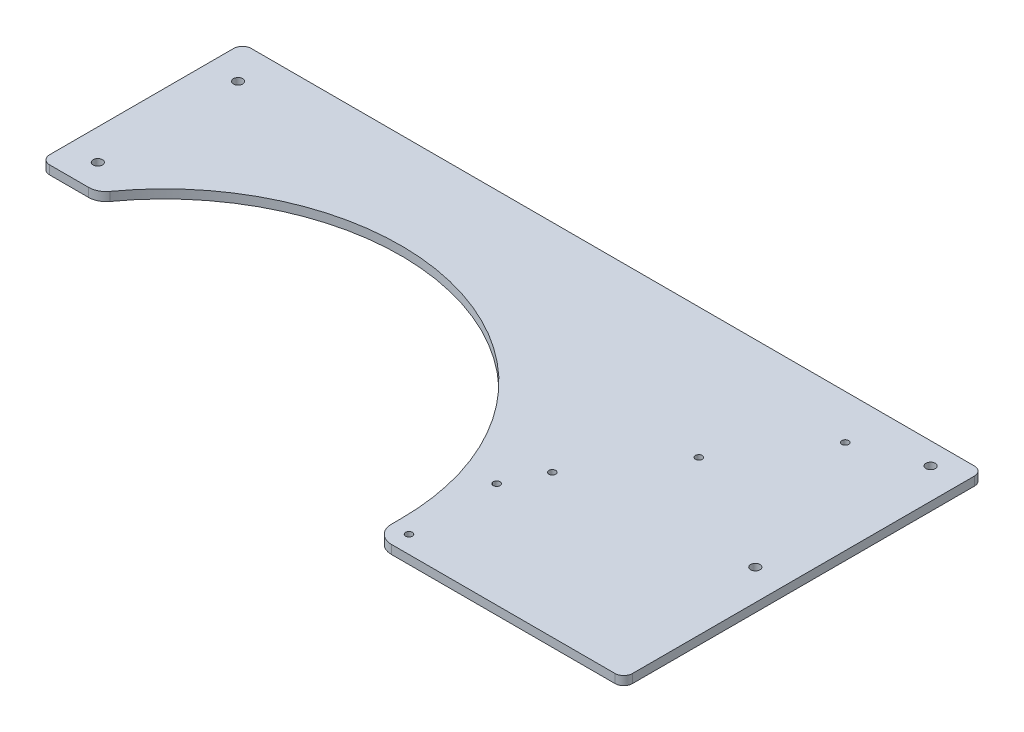
ISO-10303-21;
HEADER;
FILE_DESCRIPTION(('STEP AP214'),'2;1');
FILE_NAME('part.step','',(''),(''),'','','');
FILE_SCHEMA(('AUTOMOTIVE_DESIGN { 1 0 10303 214 1 1 1 1 }'));
ENDSEC;
DATA;
#1=APPLICATION_CONTEXT('core data for automotive mechanical design processes');
#2=APPLICATION_PROTOCOL_DEFINITION('international standard','automotive_design',2000,#1);
#3=PRODUCT_CONTEXT('',#1,'mechanical');
#4=PRODUCT('Part','Part','',(#3));
#5=PRODUCT_RELATED_PRODUCT_CATEGORY('part','',(#4));
#6=PRODUCT_DEFINITION_FORMATION('','',#4);
#7=PRODUCT_DEFINITION_CONTEXT('part definition',#1,'design');
#8=PRODUCT_DEFINITION('design','',#6,#7);
#9=PRODUCT_DEFINITION_SHAPE('','',#8);
#10=(LENGTH_UNIT() NAMED_UNIT(*) SI_UNIT(.MILLI.,.METRE.));
#11=(NAMED_UNIT(*) PLANE_ANGLE_UNIT() SI_UNIT($,.RADIAN.));
#12=(NAMED_UNIT(*) SI_UNIT($,.STERADIAN.) SOLID_ANGLE_UNIT());
#13=UNCERTAINTY_MEASURE_WITH_UNIT(LENGTH_MEASURE(1.E-05),#10,'distance_accuracy_value','');
#14=(GEOMETRIC_REPRESENTATION_CONTEXT(3) GLOBAL_UNCERTAINTY_ASSIGNED_CONTEXT((#13)) GLOBAL_UNIT_ASSIGNED_CONTEXT((#10,
#11,#12)) REPRESENTATION_CONTEXT('',''));
#15=CARTESIAN_POINT('',(0.,0.,0.));
#16=DIRECTION('',(0.,0.,1.));
#17=DIRECTION('',(1.,0.,0.));
#18=AXIS2_PLACEMENT_3D('',#15,#16,#17);
#19=CARTESIAN_POINT('',(268.2875,6.35,130.175));
#20=DIRECTION('',(-1.,0.,0.));
#21=DIRECTION('',(0.,0.,1.));
#22=AXIS2_PLACEMENT_3D('',#19,#20,#21);
#23=PLANE('',#22);
#24=DIRECTION('',(0.,0.,-1.));
#25=VECTOR('',#24,1.);
#26=CARTESIAN_POINT('',(268.2875,0.,130.175));
#27=LINE('',#26,#25);
#28=CARTESIAN_POINT('',(268.2875,0.,123.825));
#29=VERTEX_POINT('',#28);
#30=CARTESIAN_POINT('',(268.2875,0.,-123.825));
#31=VERTEX_POINT('',#30);
#32=EDGE_CURVE('E233',#29,#31,#27,.T.);
#33=ORIENTED_EDGE('',*,*,#32,.T.);
#34=DIRECTION('',(0.,-1.,0.));
#35=VECTOR('',#34,1.);
#36=CARTESIAN_POINT('',(268.2875,6.35,-123.825));
#37=LINE('',#36,#35);
#38=CARTESIAN_POINT('',(268.2875,6.35,-123.825));
#39=VERTEX_POINT('',#38);
#40=EDGE_CURVE('E294',#31,#39,#37,.F.);
#41=ORIENTED_EDGE('',*,*,#40,.T.);
#42=DIRECTION('',(0.,0.,-1.));
#43=VECTOR('',#42,1.);
#44=CARTESIAN_POINT('',(268.2875,6.35,130.175));
#45=LINE('',#44,#43);
#46=CARTESIAN_POINT('',(268.2875,6.35,123.825));
#47=VERTEX_POINT('',#46);
#48=EDGE_CURVE('E234',#47,#39,#45,.T.);
#49=ORIENTED_EDGE('',*,*,#48,.F.);
#50=DIRECTION('',(0.,-1.,0.));
#51=VECTOR('',#50,1.);
#52=CARTESIAN_POINT('',(268.2875,6.35,123.825));
#53=LINE('',#52,#51);
#54=EDGE_CURVE('E290',#47,#29,#53,.T.);
#55=ORIENTED_EDGE('',*,*,#54,.T.);
#56=EDGE_LOOP('',(#33,#41,#49,#55));
#57=FACE_BOUND('',#56,.T.);
#58=ADVANCED_FACE('F37',(#57),#23,.F.);
#59=CARTESIAN_POINT('',(-268.2875,6.35,-130.175));
#60=DIRECTION('',(0.,0.,1.));
#61=DIRECTION('',(1.,0.,0.));
#62=AXIS2_PLACEMENT_3D('',#59,#60,#61);
#63=PLANE('',#62);
#64=DIRECTION('',(-1.,0.,0.));
#65=VECTOR('',#64,1.);
#66=CARTESIAN_POINT('',(-268.2875,6.35,-130.175));
#67=LINE('',#66,#65);
#68=CARTESIAN_POINT('',(261.9375,6.35,-130.175));
#69=VERTEX_POINT('',#68);
#70=CARTESIAN_POINT('',(-261.9375,6.35,-130.175));
#71=VERTEX_POINT('',#70);
#72=EDGE_CURVE('E238',#69,#71,#67,.T.);
#73=ORIENTED_EDGE('',*,*,#72,.F.);
#74=DIRECTION('',(0.,-1.,0.));
#75=VECTOR('',#74,1.);
#76=CARTESIAN_POINT('',(261.9375,6.35,-130.175));
#77=LINE('',#76,#75);
#78=CARTESIAN_POINT('',(261.9375,0.,-130.175));
#79=VERTEX_POINT('',#78);
#80=EDGE_CURVE('E273',#69,#79,#77,.T.);
#81=ORIENTED_EDGE('',*,*,#80,.T.);
#82=DIRECTION('',(-1.,0.,0.));
#83=VECTOR('',#82,1.);
#84=CARTESIAN_POINT('',(-268.2875,0.,-130.175));
#85=LINE('',#84,#83);
#86=CARTESIAN_POINT('',(-261.9375,0.,-130.175));
#87=VERTEX_POINT('',#86);
#88=EDGE_CURVE('E258',#79,#87,#85,.T.);
#89=ORIENTED_EDGE('',*,*,#88,.T.);
#90=DIRECTION('',(0.,-1.,0.));
#91=VECTOR('',#90,1.);
#92=CARTESIAN_POINT('',(-261.9375,6.35,-130.175));
#93=LINE('',#92,#91);
#94=EDGE_CURVE('E254',#87,#71,#93,.F.);
#95=ORIENTED_EDGE('',*,*,#94,.T.);
#96=EDGE_LOOP('',(#73,#81,#89,#95));
#97=FACE_BOUND('',#96,.T.);
#98=ADVANCED_FACE('F365',(#97),#63,.F.);
#99=CARTESIAN_POINT('',(-268.2875,6.35,15.875));
#100=DIRECTION('',(1.,0.,0.));
#101=DIRECTION('',(0.,0.,-1.));
#102=AXIS2_PLACEMENT_3D('',#99,#100,#101);
#103=PLANE('',#102);
#104=DIRECTION('',(0.,0.,1.));
#105=VECTOR('',#104,1.);
#106=CARTESIAN_POINT('',(-268.2875,0.,15.875));
#107=LINE('',#106,#105);
#108=CARTESIAN_POINT('',(-268.2875,0.,-123.825));
#109=VERTEX_POINT('',#108);
#110=CARTESIAN_POINT('',(-268.2875,0.,9.52499999999997));
#111=VERTEX_POINT('',#110);
#112=EDGE_CURVE('E262',#109,#111,#107,.T.);
#113=ORIENTED_EDGE('',*,*,#112,.T.);
#114=DIRECTION('',(0.,-1.,0.));
#115=VECTOR('',#114,1.);
#116=CARTESIAN_POINT('',(-268.2875,6.35,9.52499999999997));
#117=LINE('',#116,#115);
#118=CARTESIAN_POINT('',(-268.2875,6.35,9.52499999999997));
#119=VERTEX_POINT('',#118);
#120=EDGE_CURVE('E321',#111,#119,#117,.F.);
#121=ORIENTED_EDGE('',*,*,#120,.T.);
#122=DIRECTION('',(0.,0.,1.));
#123=VECTOR('',#122,1.);
#124=CARTESIAN_POINT('',(-268.2875,6.35,15.875));
#125=LINE('',#124,#123);
#126=CARTESIAN_POINT('',(-268.2875,6.35,-123.825));
#127=VERTEX_POINT('',#126);
#128=EDGE_CURVE('E243',#127,#119,#125,.T.);
#129=ORIENTED_EDGE('',*,*,#128,.F.);
#130=DIRECTION('',(0.,-1.,0.));
#131=VECTOR('',#130,1.);
#132=CARTESIAN_POINT('',(-268.2875,6.35,-123.825));
#133=LINE('',#132,#131);
#134=EDGE_CURVE('E317',#127,#109,#133,.T.);
#135=ORIENTED_EDGE('',*,*,#134,.T.);
#136=EDGE_LOOP('',(#113,#121,#129,#135));
#137=FACE_BOUND('',#136,.T.);
#138=ADVANCED_FACE('F356',(#137),#103,.F.);
#139=CARTESIAN_POINT('',(-268.2875,6.35,15.875));
#140=DIRECTION('',(0.,0.,-1.));
#141=DIRECTION('',(-1.,0.,0.));
#142=AXIS2_PLACEMENT_3D('',#139,#140,#141);
#143=PLANE('',#142);
#144=DIRECTION('',(1.,0.,0.));
#145=VECTOR('',#144,1.);
#146=CARTESIAN_POINT('',(-268.2875,0.,15.875));
#147=LINE('',#146,#145);
#148=CARTESIAN_POINT('',(-261.9375,0.,15.875));
#149=VERTEX_POINT('',#148);
#150=CARTESIAN_POINT('',(-233.673023435189,0.,15.875));
#151=VERTEX_POINT('',#150);
#152=EDGE_CURVE('E266',#149,#151,#147,.T.);
#153=ORIENTED_EDGE('',*,*,#152,.T.);
#154=DIRECTION('',(0.,-1.,0.));
#155=VECTOR('',#154,1.);
#156=CARTESIAN_POINT('',(-233.673023435189,6.35,15.875));
#157=LINE('',#156,#155);
#158=CARTESIAN_POINT('',(-233.673023435189,6.35,15.875));
#159=VERTEX_POINT('',#158);
#160=EDGE_CURVE('E46',#151,#159,#157,.F.);
#161=ORIENTED_EDGE('',*,*,#160,.T.);
#162=DIRECTION('',(1.,0.,0.));
#163=VECTOR('',#162,1.);
#164=CARTESIAN_POINT('',(-268.2875,6.35,15.875));
#165=LINE('',#164,#163);
#166=CARTESIAN_POINT('',(-261.9375,6.35,15.875));
#167=VERTEX_POINT('',#166);
#168=EDGE_CURVE('E247',#167,#159,#165,.T.);
#169=ORIENTED_EDGE('',*,*,#168,.F.);
#170=DIRECTION('',(0.,-1.,0.));
#171=VECTOR('',#170,1.);
#172=CARTESIAN_POINT('',(-261.9375,6.35,15.875));
#173=LINE('',#172,#171);
#174=EDGE_CURVE('E313',#167,#149,#173,.T.);
#175=ORIENTED_EDGE('',*,*,#174,.T.);
#176=EDGE_LOOP('',(#153,#161,#169,#175));
#177=FACE_BOUND('',#176,.T.);
#178=ADVANCED_FACE('F344',(#177),#143,.F.);
#179=CARTESIAN_POINT('',(-227.0125,6.35,130.175));
#180=DIRECTION('',(0.,0.,-1.));
#181=DIRECTION('',(-1.,0.,0.));
#182=AXIS2_PLACEMENT_3D('',#179,#180,#181);
#183=PLANE('',#182);
#184=DIRECTION('',(1.,0.,0.));
#185=VECTOR('',#184,1.);
#186=CARTESIAN_POINT('',(-227.0125,6.35,130.175));
#187=LINE('',#186,#185);
#188=CARTESIAN_POINT('',(100.0125,6.35,130.175));
#189=VERTEX_POINT('',#188);
#190=CARTESIAN_POINT('',(261.9375,6.35,130.175));
#191=VERTEX_POINT('',#190);
#192=EDGE_CURVE('E251',#189,#191,#187,.T.);
#193=ORIENTED_EDGE('',*,*,#192,.F.);
#194=DIRECTION('',(0.,1.,0.));
#195=VECTOR('',#194,1.);
#196=CARTESIAN_POINT('',(100.0125,6.35,130.175));
#197=LINE('',#196,#195);
#198=CARTESIAN_POINT('',(100.0125,0.,130.175));
#199=VERTEX_POINT('',#198);
#200=EDGE_CURVE('E332',#189,#199,#197,.F.);
#201=ORIENTED_EDGE('',*,*,#200,.T.);
#202=DIRECTION('',(1.,0.,0.));
#203=VECTOR('',#202,1.);
#204=CARTESIAN_POINT('',(-227.0125,0.,130.175));
#205=LINE('',#204,#203);
#206=CARTESIAN_POINT('',(261.9375,0.,130.175));
#207=VERTEX_POINT('',#206);
#208=EDGE_CURVE('E239',#199,#207,#205,.T.);
#209=ORIENTED_EDGE('',*,*,#208,.T.);
#210=DIRECTION('',(0.,-1.,0.));
#211=VECTOR('',#210,1.);
#212=CARTESIAN_POINT('',(261.9375,6.35,130.175));
#213=LINE('',#212,#211);
#214=EDGE_CURVE('E309',#207,#191,#213,.F.);
#215=ORIENTED_EDGE('',*,*,#214,.T.);
#216=EDGE_LOOP('',(#193,#201,#209,#215));
#217=FACE_BOUND('',#216,.T.);
#218=ADVANCED_FACE('F445',(#217),#183,.F.);
#219=CARTESIAN_POINT('',(-233.3625,6.35,22.225));
#220=DIRECTION('',(0.,-1.,0.));
#221=DIRECTION('',(0.,0.,-1.));
#222=AXIS2_PLACEMENT_3D('',#219,#220,#221);
#223=PLANE('',#222);
#224=CARTESIAN_POINT('',(200.4455888999,6.35,-98.1535315496422));
#225=DIRECTION('',(0.,1.,0.));
#226=DIRECTION('',(0.,0.,1.));
#227=AXIS2_PLACEMENT_3D('',#224,#225,#226);
#228=CIRCLE('',#227,2.45745);
#229=CARTESIAN_POINT('',(200.4455888999,6.35,-95.6960815496422));
#230=VERTEX_POINT('',#229);
#231=EDGE_CURVE('E155',#230,#230,#228,.T.);
#232=ORIENTED_EDGE('',*,*,#231,.F.);
#233=EDGE_LOOP('',(#232));
#234=FACE_BOUND('',#233,.T.);
#235=CARTESIAN_POINT('',(156.73906444995,6.35,-35.7341457748211));
#236=DIRECTION('',(0.,1.,0.));
#237=DIRECTION('',(0.,0.,1.));
#238=AXIS2_PLACEMENT_3D('',#235,#236,#237);
#239=CIRCLE('',#238,2.45745);
#240=CARTESIAN_POINT('',(156.73906444995,6.35,-33.2766957748211));
#241=VERTEX_POINT('',#240);
#242=EDGE_CURVE('E169',#241,#241,#239,.T.);
#243=ORIENTED_EDGE('',*,*,#242,.F.);
#244=EDGE_LOOP('',(#243));
#245=FACE_BOUND('',#244,.T.);
#246=CARTESIAN_POINT('',(113.03254,6.35,26.68524));
#247=DIRECTION('',(0.,1.,0.));
#248=DIRECTION('',(0.,0.,1.));
#249=AXIS2_PLACEMENT_3D('',#246,#247,#248);
#250=CIRCLE('',#249,2.45745);
#251=CARTESIAN_POINT('',(113.03254,6.35,29.14269));
#252=VERTEX_POINT('',#251);
#253=EDGE_CURVE('E177',#252,#252,#250,.T.);
#254=ORIENTED_EDGE('',*,*,#253,.F.);
#255=EDGE_LOOP('',(#254));
#256=FACE_BOUND('',#255,.T.);
#257=CARTESIAN_POINT('',(100.0125,6.35,53.975));
#258=DIRECTION('',(0.,1.,0.));
#259=DIRECTION('',(0.,0.,1.));
#260=AXIS2_PLACEMENT_3D('',#257,#258,#259);
#261=CIRCLE('',#260,2.45745);
#262=CARTESIAN_POINT('',(100.0125,6.35,56.43245));
#263=VERTEX_POINT('',#262);
#264=EDGE_CURVE('E185',#263,#263,#261,.T.);
#265=ORIENTED_EDGE('',*,*,#264,.F.);
#266=EDGE_LOOP('',(#265));
#267=FACE_BOUND('',#266,.T.);
#268=CARTESIAN_POINT('',(100.0125,6.35,117.475));
#269=DIRECTION('',(0.,1.,0.));
#270=DIRECTION('',(0.,0.,1.));
#271=AXIS2_PLACEMENT_3D('',#268,#269,#270);
#272=CIRCLE('',#271,2.45745);
#273=CARTESIAN_POINT('',(100.0125,6.35,119.93245));
#274=VERTEX_POINT('',#273);
#275=EDGE_CURVE('E193',#274,#274,#272,.T.);
#276=ORIENTED_EDGE('',*,*,#275,.F.);
#277=EDGE_LOOP('',(#276));
#278=FACE_BOUND('',#277,.T.);
#279=CARTESIAN_POINT('',(-246.0625,6.35,-104.775));
#280=DIRECTION('',(0.,1.,0.));
#281=DIRECTION('',(0.,0.,1.));
#282=AXIS2_PLACEMENT_3D('',#279,#280,#281);
#283=CIRCLE('',#282,3.373501);
#284=CARTESIAN_POINT('',(-246.0625,6.35,-101.401499));
#285=VERTEX_POINT('',#284);
#286=EDGE_CURVE('E201',#285,#285,#283,.T.);
#287=ORIENTED_EDGE('',*,*,#286,.F.);
#288=EDGE_LOOP('',(#287));
#289=FACE_BOUND('',#288,.T.);
#290=CARTESIAN_POINT('',(-246.0625,6.35,-3.17499999999998));
#291=DIRECTION('',(0.,1.,0.));
#292=DIRECTION('',(0.,0.,1.));
#293=AXIS2_PLACEMENT_3D('',#290,#291,#292);
#294=CIRCLE('',#293,3.373501);
#295=CARTESIAN_POINT('',(-246.0625,6.35,0.198501000000018));
#296=VERTEX_POINT('',#295);
#297=EDGE_CURVE('E209',#296,#296,#294,.T.);
#298=ORIENTED_EDGE('',*,*,#297,.F.);
#299=EDGE_LOOP('',(#298));
#300=FACE_BOUND('',#299,.T.);
#301=CARTESIAN_POINT('',(246.0625,6.35,-114.3381));
#302=DIRECTION('',(0.,1.,0.));
#303=DIRECTION('',(0.,0.,1.));
#304=AXIS2_PLACEMENT_3D('',#301,#302,#303);
#305=CIRCLE('',#304,3.373501);
#306=CARTESIAN_POINT('',(246.0625,6.35,-110.964599));
#307=VERTEX_POINT('',#306);
#308=EDGE_CURVE('E217',#307,#307,#305,.T.);
#309=ORIENTED_EDGE('',*,*,#308,.F.);
#310=EDGE_LOOP('',(#309));
#311=FACE_BOUND('',#310,.T.);
#312=CARTESIAN_POINT('',(246.0625,6.35,12.6619));
#313=DIRECTION('',(0.,1.,0.));
#314=DIRECTION('',(0.,0.,1.));
#315=AXIS2_PLACEMENT_3D('',#312,#313,#314);
#316=CIRCLE('',#315,3.373501);
#317=CARTESIAN_POINT('',(246.0625,6.35,16.035401));
#318=VERTEX_POINT('',#317);
#319=EDGE_CURVE('E225',#318,#318,#316,.T.);
#320=ORIENTED_EDGE('',*,*,#319,.F.);
#321=EDGE_LOOP('',(#320));
#322=FACE_BOUND('',#321,.T.);
#323=DIRECTION('',(0.,0.,-1.));
#324=VECTOR('',#323,1.);
#325=CARTESIAN_POINT('',(87.3125000000002,6.35,1.24102692156602E-13));
#326=LINE('',#325,#324);
#327=CARTESIAN_POINT('',(87.3125,6.35,117.475));
#328=VERTEX_POINT('',#327);
#329=CARTESIAN_POINT('',(87.3125,6.35,110.647553384405));
#330=VERTEX_POINT('',#329);
#331=EDGE_CURVE('E138',#328,#330,#326,.T.);
#332=ORIENTED_EDGE('',*,*,#331,.F.);
#333=CARTESIAN_POINT('',(100.0125,6.35,117.475));
#334=DIRECTION('',(0.,-1.,0.));
#335=DIRECTION('',(0.,0.,-1.));
#336=AXIS2_PLACEMENT_3D('',#333,#334,#335);
#337=CIRCLE('',#336,12.7);
#338=EDGE_CURVE('E329',#328,#189,#337,.F.);
#339=ORIENTED_EDGE('',*,*,#338,.T.);
#340=ORIENTED_EDGE('',*,*,#192,.T.);
#341=CARTESIAN_POINT('',(261.9375,6.35,123.825));
#342=DIRECTION('',(0.,-1.,0.));
#343=DIRECTION('',(0.,0.,-1.));
#344=AXIS2_PLACEMENT_3D('',#341,#342,#343);
#345=CIRCLE('',#344,6.35);
#346=EDGE_CURVE('E303',#191,#47,#345,.F.);
#347=ORIENTED_EDGE('',*,*,#346,.T.);
#348=ORIENTED_EDGE('',*,*,#48,.T.);
#349=CARTESIAN_POINT('',(261.9375,6.35,-123.825));
#350=DIRECTION('',(0.,-1.,0.));
#351=DIRECTION('',(0.,0.,-1.));
#352=AXIS2_PLACEMENT_3D('',#349,#350,#351);
#353=CIRCLE('',#352,6.35);
#354=EDGE_CURVE('E306',#39,#69,#353,.F.);
#355=ORIENTED_EDGE('',*,*,#354,.T.);
#356=ORIENTED_EDGE('',*,*,#72,.T.);
#357=CARTESIAN_POINT('',(-261.9375,6.35,-123.825));
#358=DIRECTION('',(0.,-1.,0.));
#359=DIRECTION('',(0.,0.,-1.));
#360=AXIS2_PLACEMENT_3D('',#357,#358,#359);
#361=CIRCLE('',#360,6.35);
#362=EDGE_CURVE('E297',#71,#127,#361,.F.);
#363=ORIENTED_EDGE('',*,*,#362,.T.);
#364=ORIENTED_EDGE('',*,*,#128,.T.);
#365=CARTESIAN_POINT('',(-261.9375,6.35,9.52499999999997));
#366=DIRECTION('',(0.,-1.,0.));
#367=DIRECTION('',(0.,0.,-1.));
#368=AXIS2_PLACEMENT_3D('',#365,#366,#367);
#369=CIRCLE('',#368,6.35);
#370=EDGE_CURVE('E300',#119,#167,#369,.F.);
#371=ORIENTED_EDGE('',*,*,#370,.T.);
#372=ORIENTED_EDGE('',*,*,#168,.T.);
#373=CARTESIAN_POINT('',(-233.673023435189,6.35,3.17499999999997));
#374=DIRECTION('',(0.,-1.,0.));
#375=DIRECTION('',(0.,0.,-1.));
#376=AXIS2_PLACEMENT_3D('',#373,#374,#375);
#377=CIRCLE('',#376,12.7);
#378=CARTESIAN_POINT('',(-223.360228715521,6.35,10.5869002334072));
#379=VERTEX_POINT('',#378);
#380=EDGE_CURVE('E326',#159,#379,#377,.F.);
#381=ORIENTED_EDGE('',*,*,#380,.T.);
#382=CARTESIAN_POINT('',(-84.1375,6.35,110.647553384405));
#383=DIRECTION('',(0.,1.,0.));
#384=DIRECTION('',(0.,0.,1.));
#385=AXIS2_PLACEMENT_3D('',#382,#383,#384);
#386=CIRCLE('',#385,171.45);
#387=EDGE_CURVE('E384',#379,#330,#386,.F.);
#388=ORIENTED_EDGE('',*,*,#387,.T.);
#389=EDGE_LOOP('',(#332,#339,#340,#347,#348,#355,#356,#363,#364,#371,#372,#381,#388));
#390=FACE_BOUND('',#389,.T.);
#391=ADVANCED_FACE('F348',(#234,#245,#256,#267,#278,#289,#300,#311,#322,#390),#223,.F.);
#392=CARTESIAN_POINT('',(-233.3625,0.,22.225));
#393=DIRECTION('',(0.,-1.,0.));
#394=DIRECTION('',(0.,0.,-1.));
#395=AXIS2_PLACEMENT_3D('',#392,#393,#394);
#396=PLANE('',#395);
#397=ORIENTED_EDGE('',*,*,#208,.F.);
#398=CARTESIAN_POINT('',(100.0125,0.,117.475));
#399=DIRECTION('',(0.,-1.,0.));
#400=DIRECTION('',(0.,0.,-1.));
#401=AXIS2_PLACEMENT_3D('',#398,#399,#400);
#402=CIRCLE('',#401,12.7);
#403=CARTESIAN_POINT('',(87.3125,0.,117.475));
#404=VERTEX_POINT('',#403);
#405=EDGE_CURVE('E145',#199,#404,#402,.T.);
#406=ORIENTED_EDGE('',*,*,#405,.T.);
#407=DIRECTION('',(0.,0.,-1.));
#408=VECTOR('',#407,1.);
#409=CARTESIAN_POINT('',(87.3125000000002,0.,1.24102692156602E-13));
#410=LINE('',#409,#408);
#411=CARTESIAN_POINT('',(87.3125,0.,110.647553384405));
#412=VERTEX_POINT('',#411);
#413=EDGE_CURVE('E137',#404,#412,#410,.T.);
#414=ORIENTED_EDGE('',*,*,#413,.T.);
#415=CARTESIAN_POINT('',(-84.1375,0.,110.647553384405));
#416=DIRECTION('',(0.,1.,0.));
#417=DIRECTION('',(0.,0.,1.));
#418=AXIS2_PLACEMENT_3D('',#415,#416,#417);
#419=CIRCLE('',#418,171.45);
#420=CARTESIAN_POINT('',(-223.360228715521,0.,10.5869002334072));
#421=VERTEX_POINT('',#420);
#422=EDGE_CURVE('E131',#421,#412,#419,.F.);
#423=ORIENTED_EDGE('',*,*,#422,.F.);
#424=CARTESIAN_POINT('',(-233.673023435189,0.,3.17499999999997));
#425=DIRECTION('',(0.,-1.,0.));
#426=DIRECTION('',(0.,0.,-1.));
#427=AXIS2_PLACEMENT_3D('',#424,#425,#426);
#428=CIRCLE('',#427,12.7);
#429=EDGE_CURVE('E53',#421,#151,#428,.T.);
#430=ORIENTED_EDGE('',*,*,#429,.T.);
#431=ORIENTED_EDGE('',*,*,#152,.F.);
#432=CARTESIAN_POINT('',(-261.9375,0.,9.52499999999997));
#433=DIRECTION('',(0.,-1.,0.));
#434=DIRECTION('',(0.,0.,-1.));
#435=AXIS2_PLACEMENT_3D('',#432,#433,#434);
#436=CIRCLE('',#435,6.35);
#437=EDGE_CURVE('E280',#149,#111,#436,.T.);
#438=ORIENTED_EDGE('',*,*,#437,.T.);
#439=ORIENTED_EDGE('',*,*,#112,.F.);
#440=CARTESIAN_POINT('',(-261.9375,0.,-123.825));
#441=DIRECTION('',(0.,-1.,0.));
#442=DIRECTION('',(0.,0.,-1.));
#443=AXIS2_PLACEMENT_3D('',#440,#441,#442);
#444=CIRCLE('',#443,6.35);
#445=EDGE_CURVE('E277',#109,#87,#444,.T.);
#446=ORIENTED_EDGE('',*,*,#445,.T.);
#447=ORIENTED_EDGE('',*,*,#88,.F.);
#448=CARTESIAN_POINT('',(261.9375,0.,-123.825));
#449=DIRECTION('',(0.,-1.,0.));
#450=DIRECTION('',(0.,0.,-1.));
#451=AXIS2_PLACEMENT_3D('',#448,#449,#450);
#452=CIRCLE('',#451,6.35);
#453=EDGE_CURVE('E287',#79,#31,#452,.T.);
#454=ORIENTED_EDGE('',*,*,#453,.T.);
#455=ORIENTED_EDGE('',*,*,#32,.F.);
#456=CARTESIAN_POINT('',(261.9375,0.,123.825));
#457=DIRECTION('',(0.,-1.,0.));
#458=DIRECTION('',(0.,0.,-1.));
#459=AXIS2_PLACEMENT_3D('',#456,#457,#458);
#460=CIRCLE('',#459,6.35);
#461=EDGE_CURVE('E283',#29,#207,#460,.T.);
#462=ORIENTED_EDGE('',*,*,#461,.T.);
#463=EDGE_LOOP('',(#397,#406,#414,#423,#430,#431,#438,#439,#446,#447,#454,#455,#462));
#464=FACE_BOUND('',#463,.T.);
#465=CARTESIAN_POINT('',(200.4455888999,0.,-98.1535315496422));
#466=DIRECTION('',(0.,1.,0.));
#467=DIRECTION('',(0.,0.,1.));
#468=AXIS2_PLACEMENT_3D('',#465,#466,#467);
#469=CIRCLE('',#468,2.45745);
#470=CARTESIAN_POINT('',(200.4455888999,0.,-95.6960815496422));
#471=VERTEX_POINT('',#470);
#472=EDGE_CURVE('E161',#471,#471,#469,.T.);
#473=ORIENTED_EDGE('',*,*,#472,.T.);
#474=EDGE_LOOP('',(#473));
#475=FACE_BOUND('',#474,.T.);
#476=CARTESIAN_POINT('',(156.73906444995,0.,-35.7341457748211));
#477=DIRECTION('',(0.,1.,0.));
#478=DIRECTION('',(0.,0.,1.));
#479=AXIS2_PLACEMENT_3D('',#476,#477,#478);
#480=CIRCLE('',#479,2.45745);
#481=CARTESIAN_POINT('',(156.73906444995,0.,-33.2766957748211));
#482=VERTEX_POINT('',#481);
#483=EDGE_CURVE('E173',#482,#482,#480,.T.);
#484=ORIENTED_EDGE('',*,*,#483,.T.);
#485=EDGE_LOOP('',(#484));
#486=FACE_BOUND('',#485,.T.);
#487=CARTESIAN_POINT('',(113.03254,0.,26.68524));
#488=DIRECTION('',(0.,1.,0.));
#489=DIRECTION('',(0.,0.,1.));
#490=AXIS2_PLACEMENT_3D('',#487,#488,#489);
#491=CIRCLE('',#490,2.45745);
#492=CARTESIAN_POINT('',(113.03254,0.,29.14269));
#493=VERTEX_POINT('',#492);
#494=EDGE_CURVE('E181',#493,#493,#491,.T.);
#495=ORIENTED_EDGE('',*,*,#494,.T.);
#496=EDGE_LOOP('',(#495));
#497=FACE_BOUND('',#496,.T.);
#498=CARTESIAN_POINT('',(100.0125,0.,53.975));
#499=DIRECTION('',(0.,1.,0.));
#500=DIRECTION('',(0.,0.,1.));
#501=AXIS2_PLACEMENT_3D('',#498,#499,#500);
#502=CIRCLE('',#501,2.45745);
#503=CARTESIAN_POINT('',(100.0125,0.,56.43245));
#504=VERTEX_POINT('',#503);
#505=EDGE_CURVE('E189',#504,#504,#502,.T.);
#506=ORIENTED_EDGE('',*,*,#505,.T.);
#507=EDGE_LOOP('',(#506));
#508=FACE_BOUND('',#507,.T.);
#509=CARTESIAN_POINT('',(100.0125,0.,117.475));
#510=DIRECTION('',(0.,1.,0.));
#511=DIRECTION('',(0.,0.,1.));
#512=AXIS2_PLACEMENT_3D('',#509,#510,#511);
#513=CIRCLE('',#512,2.45745);
#514=CARTESIAN_POINT('',(100.0125,0.,119.93245));
#515=VERTEX_POINT('',#514);
#516=EDGE_CURVE('E197',#515,#515,#513,.T.);
#517=ORIENTED_EDGE('',*,*,#516,.T.);
#518=EDGE_LOOP('',(#517));
#519=FACE_BOUND('',#518,.T.);
#520=CARTESIAN_POINT('',(-246.0625,0.,-104.775));
#521=DIRECTION('',(0.,1.,0.));
#522=DIRECTION('',(0.,0.,1.));
#523=AXIS2_PLACEMENT_3D('',#520,#521,#522);
#524=CIRCLE('',#523,3.373501);
#525=CARTESIAN_POINT('',(-246.0625,0.,-101.401499));
#526=VERTEX_POINT('',#525);
#527=EDGE_CURVE('E205',#526,#526,#524,.T.);
#528=ORIENTED_EDGE('',*,*,#527,.T.);
#529=EDGE_LOOP('',(#528));
#530=FACE_BOUND('',#529,.T.);
#531=CARTESIAN_POINT('',(-246.0625,0.,-3.17499999999998));
#532=DIRECTION('',(0.,1.,0.));
#533=DIRECTION('',(0.,0.,1.));
#534=AXIS2_PLACEMENT_3D('',#531,#532,#533);
#535=CIRCLE('',#534,3.373501);
#536=CARTESIAN_POINT('',(-246.0625,0.,0.198501000000018));
#537=VERTEX_POINT('',#536);
#538=EDGE_CURVE('E213',#537,#537,#535,.T.);
#539=ORIENTED_EDGE('',*,*,#538,.T.);
#540=EDGE_LOOP('',(#539));
#541=FACE_BOUND('',#540,.T.);
#542=CARTESIAN_POINT('',(246.0625,0.,-114.3381));
#543=DIRECTION('',(0.,1.,0.));
#544=DIRECTION('',(0.,0.,1.));
#545=AXIS2_PLACEMENT_3D('',#542,#543,#544);
#546=CIRCLE('',#545,3.373501);
#547=CARTESIAN_POINT('',(246.0625,0.,-110.964599));
#548=VERTEX_POINT('',#547);
#549=EDGE_CURVE('E221',#548,#548,#546,.T.);
#550=ORIENTED_EDGE('',*,*,#549,.T.);
#551=EDGE_LOOP('',(#550));
#552=FACE_BOUND('',#551,.T.);
#553=CARTESIAN_POINT('',(246.0625,0.,12.6619));
#554=DIRECTION('',(0.,1.,0.));
#555=DIRECTION('',(0.,0.,1.));
#556=AXIS2_PLACEMENT_3D('',#553,#554,#555);
#557=CIRCLE('',#556,3.373501);
#558=CARTESIAN_POINT('',(246.0625,0.,16.035401));
#559=VERTEX_POINT('',#558);
#560=EDGE_CURVE('E229',#559,#559,#557,.T.);
#561=ORIENTED_EDGE('',*,*,#560,.T.);
#562=EDGE_LOOP('',(#561));
#563=FACE_BOUND('',#562,.T.);
#564=ADVANCED_FACE('F142',(#464,#475,#486,#497,#508,#519,#530,#541,#552,#563),#396,.T.);
#565=CARTESIAN_POINT('',(246.0625,6.35,12.6619));
#566=DIRECTION('',(0.,1.,0.));
#567=DIRECTION('',(0.,0.,1.));
#568=AXIS2_PLACEMENT_3D('',#565,#566,#567);
#569=CYLINDRICAL_SURFACE('',#568,3.373501);
#570=ORIENTED_EDGE('',*,*,#560,.F.);
#571=EDGE_LOOP('',(#570));
#572=FACE_BOUND('',#571,.T.);
#573=ORIENTED_EDGE('',*,*,#319,.T.);
#574=EDGE_LOOP('',(#573));
#575=FACE_BOUND('',#574,.T.);
#576=ADVANCED_FACE('F438',(#572,#575),#569,.F.);
#577=CARTESIAN_POINT('',(246.0625,6.35,-114.3381));
#578=DIRECTION('',(0.,1.,0.));
#579=DIRECTION('',(0.,0.,1.));
#580=AXIS2_PLACEMENT_3D('',#577,#578,#579);
#581=CYLINDRICAL_SURFACE('',#580,3.373501);
#582=ORIENTED_EDGE('',*,*,#549,.F.);
#583=EDGE_LOOP('',(#582));
#584=FACE_BOUND('',#583,.T.);
#585=ORIENTED_EDGE('',*,*,#308,.T.);
#586=EDGE_LOOP('',(#585));
#587=FACE_BOUND('',#586,.T.);
#588=ADVANCED_FACE('F434',(#584,#587),#581,.F.);
#589=CARTESIAN_POINT('',(-246.0625,6.35,-3.17499999999998));
#590=DIRECTION('',(0.,1.,0.));
#591=DIRECTION('',(0.,0.,1.));
#592=AXIS2_PLACEMENT_3D('',#589,#590,#591);
#593=CYLINDRICAL_SURFACE('',#592,3.373501);
#594=ORIENTED_EDGE('',*,*,#538,.F.);
#595=EDGE_LOOP('',(#594));
#596=FACE_BOUND('',#595,.T.);
#597=ORIENTED_EDGE('',*,*,#297,.T.);
#598=EDGE_LOOP('',(#597));
#599=FACE_BOUND('',#598,.T.);
#600=ADVANCED_FACE('F430',(#596,#599),#593,.F.);
#601=CARTESIAN_POINT('',(-246.0625,6.35,-104.775));
#602=DIRECTION('',(0.,1.,0.));
#603=DIRECTION('',(0.,0.,1.));
#604=AXIS2_PLACEMENT_3D('',#601,#602,#603);
#605=CYLINDRICAL_SURFACE('',#604,3.373501);
#606=ORIENTED_EDGE('',*,*,#527,.F.);
#607=EDGE_LOOP('',(#606));
#608=FACE_BOUND('',#607,.T.);
#609=ORIENTED_EDGE('',*,*,#286,.T.);
#610=EDGE_LOOP('',(#609));
#611=FACE_BOUND('',#610,.T.);
#612=ADVANCED_FACE('F405',(#608,#611),#605,.F.);
#613=CARTESIAN_POINT('',(261.9375,6.35,-123.825));
#614=DIRECTION('',(0.,-1.,0.));
#615=DIRECTION('',(0.,0.,-1.));
#616=AXIS2_PLACEMENT_3D('',#613,#614,#615);
#617=CYLINDRICAL_SURFACE('',#616,6.35);
#618=ORIENTED_EDGE('',*,*,#354,.F.);
#619=ORIENTED_EDGE('',*,*,#40,.F.);
#620=ORIENTED_EDGE('',*,*,#453,.F.);
#621=ORIENTED_EDGE('',*,*,#80,.F.);
#622=EDGE_LOOP('',(#618,#619,#620,#621));
#623=FACE_BOUND('',#622,.T.);
#624=ADVANCED_FACE('F369',(#623),#617,.T.);
#625=CARTESIAN_POINT('',(261.9375,6.35,123.825));
#626=DIRECTION('',(0.,-1.,0.));
#627=DIRECTION('',(0.,0.,-1.));
#628=AXIS2_PLACEMENT_3D('',#625,#626,#627);
#629=CYLINDRICAL_SURFACE('',#628,6.35);
#630=ORIENTED_EDGE('',*,*,#346,.F.);
#631=ORIENTED_EDGE('',*,*,#214,.F.);
#632=ORIENTED_EDGE('',*,*,#461,.F.);
#633=ORIENTED_EDGE('',*,*,#54,.F.);
#634=EDGE_LOOP('',(#630,#631,#632,#633));
#635=FACE_BOUND('',#634,.T.);
#636=ADVANCED_FACE('F377',(#635),#629,.T.);
#637=CARTESIAN_POINT('',(-261.9375,6.35,9.52499999999997));
#638=DIRECTION('',(0.,-1.,0.));
#639=DIRECTION('',(0.,0.,-1.));
#640=AXIS2_PLACEMENT_3D('',#637,#638,#639);
#641=CYLINDRICAL_SURFACE('',#640,6.35);
#642=ORIENTED_EDGE('',*,*,#370,.F.);
#643=ORIENTED_EDGE('',*,*,#120,.F.);
#644=ORIENTED_EDGE('',*,*,#437,.F.);
#645=ORIENTED_EDGE('',*,*,#174,.F.);
#646=EDGE_LOOP('',(#642,#643,#644,#645));
#647=FACE_BOUND('',#646,.T.);
#648=ADVANCED_FACE('F353',(#647),#641,.T.);
#649=CARTESIAN_POINT('',(-261.9375,6.35,-123.825));
#650=DIRECTION('',(0.,-1.,0.));
#651=DIRECTION('',(0.,0.,-1.));
#652=AXIS2_PLACEMENT_3D('',#649,#650,#651);
#653=CYLINDRICAL_SURFACE('',#652,6.35);
#654=ORIENTED_EDGE('',*,*,#362,.F.);
#655=ORIENTED_EDGE('',*,*,#94,.F.);
#656=ORIENTED_EDGE('',*,*,#445,.F.);
#657=ORIENTED_EDGE('',*,*,#134,.F.);
#658=EDGE_LOOP('',(#654,#655,#656,#657));
#659=FACE_BOUND('',#658,.T.);
#660=ADVANCED_FACE('F360',(#659),#653,.T.);
#661=CARTESIAN_POINT('',(100.0125,6.35,117.475));
#662=DIRECTION('',(0.,1.,0.));
#663=DIRECTION('',(0.,0.,1.));
#664=AXIS2_PLACEMENT_3D('',#661,#662,#663);
#665=CYLINDRICAL_SURFACE('',#664,2.45745);
#666=ORIENTED_EDGE('',*,*,#516,.F.);
#667=EDGE_LOOP('',(#666));
#668=FACE_BOUND('',#667,.T.);
#669=ORIENTED_EDGE('',*,*,#275,.T.);
#670=EDGE_LOOP('',(#669));
#671=FACE_BOUND('',#670,.T.);
#672=ADVANCED_FACE('F411',(#668,#671),#665,.F.);
#673=CARTESIAN_POINT('',(100.0125,6.35,53.975));
#674=DIRECTION('',(0.,1.,0.));
#675=DIRECTION('',(0.,0.,1.));
#676=AXIS2_PLACEMENT_3D('',#673,#674,#675);
#677=CYLINDRICAL_SURFACE('',#676,2.45745);
#678=ORIENTED_EDGE('',*,*,#505,.F.);
#679=EDGE_LOOP('',(#678));
#680=FACE_BOUND('',#679,.T.);
#681=ORIENTED_EDGE('',*,*,#264,.T.);
#682=EDGE_LOOP('',(#681));
#683=FACE_BOUND('',#682,.T.);
#684=ADVANCED_FACE('F415',(#680,#683),#677,.F.);
#685=CARTESIAN_POINT('',(113.03254,6.35,26.68524));
#686=DIRECTION('',(0.,1.,0.));
#687=DIRECTION('',(0.,0.,1.));
#688=AXIS2_PLACEMENT_3D('',#685,#686,#687);
#689=CYLINDRICAL_SURFACE('',#688,2.45745);
#690=ORIENTED_EDGE('',*,*,#494,.F.);
#691=EDGE_LOOP('',(#690));
#692=FACE_BOUND('',#691,.T.);
#693=ORIENTED_EDGE('',*,*,#253,.T.);
#694=EDGE_LOOP('',(#693));
#695=FACE_BOUND('',#694,.T.);
#696=ADVANCED_FACE('F421',(#692,#695),#689,.F.);
#697=CARTESIAN_POINT('',(156.73906444995,6.35,-35.7341457748211));
#698=DIRECTION('',(0.,1.,0.));
#699=DIRECTION('',(0.,0.,1.));
#700=AXIS2_PLACEMENT_3D('',#697,#698,#699);
#701=CYLINDRICAL_SURFACE('',#700,2.45745);
#702=ORIENTED_EDGE('',*,*,#483,.F.);
#703=EDGE_LOOP('',(#702));
#704=FACE_BOUND('',#703,.T.);
#705=ORIENTED_EDGE('',*,*,#242,.T.);
#706=EDGE_LOOP('',(#705));
#707=FACE_BOUND('',#706,.T.);
#708=ADVANCED_FACE('F524',(#704,#707),#701,.F.);
#709=CARTESIAN_POINT('',(200.4455888999,6.35,-98.1535315496422));
#710=DIRECTION('',(0.,1.,0.));
#711=DIRECTION('',(0.,0.,1.));
#712=AXIS2_PLACEMENT_3D('',#709,#710,#711);
#713=CYLINDRICAL_SURFACE('',#712,2.45745);
#714=ORIENTED_EDGE('',*,*,#472,.F.);
#715=EDGE_LOOP('',(#714));
#716=FACE_BOUND('',#715,.T.);
#717=ORIENTED_EDGE('',*,*,#231,.T.);
#718=EDGE_LOOP('',(#717));
#719=FACE_BOUND('',#718,.T.);
#720=ADVANCED_FACE('F533',(#716,#719),#713,.F.);
#721=CARTESIAN_POINT('',(-84.1375,0.,110.647553384405));
#722=DIRECTION('',(0.,1.,0.));
#723=DIRECTION('',(0.,0.,1.));
#724=AXIS2_PLACEMENT_3D('',#721,#722,#723);
#725=CYLINDRICAL_SURFACE('',#724,171.45);
#726=ORIENTED_EDGE('',*,*,#387,.F.);
#727=DIRECTION('',(0.,1.,0.));
#728=VECTOR('',#727,1.);
#729=CARTESIAN_POINT('',(-223.360228715521,0.,10.5869002334072));
#730=LINE('',#729,#728);
#731=EDGE_CURVE('E12',#379,#421,#730,.F.);
#732=ORIENTED_EDGE('',*,*,#731,.T.);
#733=ORIENTED_EDGE('',*,*,#422,.T.);
#734=DIRECTION('',(0.,1.,0.));
#735=VECTOR('',#734,1.);
#736=CARTESIAN_POINT('',(87.3125,0.,110.647553384405));
#737=LINE('',#736,#735);
#738=EDGE_CURVE('E135',#412,#330,#737,.T.);
#739=ORIENTED_EDGE('',*,*,#738,.T.);
#740=EDGE_LOOP('',(#726,#732,#733,#739));
#741=FACE_BOUND('',#740,.T.);
#742=ADVANCED_FACE('F133',(#741),#725,.F.);
#743=CARTESIAN_POINT('',(87.3125000000002,0.,1.24102692156602E-13));
#744=DIRECTION('',(1.,0.,0.));
#745=DIRECTION('',(0.,0.,-1.));
#746=AXIS2_PLACEMENT_3D('',#743,#744,#745);
#747=PLANE('',#746);
#748=ORIENTED_EDGE('',*,*,#413,.F.);
#749=DIRECTION('',(0.,1.,0.));
#750=VECTOR('',#749,1.);
#751=CARTESIAN_POINT('',(87.3125,0.,117.475));
#752=LINE('',#751,#750);
#753=EDGE_CURVE('E324',#404,#328,#752,.T.);
#754=ORIENTED_EDGE('',*,*,#753,.T.);
#755=ORIENTED_EDGE('',*,*,#331,.T.);
#756=ORIENTED_EDGE('',*,*,#738,.F.);
#757=EDGE_LOOP('',(#748,#754,#755,#756));
#758=FACE_BOUND('',#757,.T.);
#759=ADVANCED_FACE('F152',(#758),#747,.F.);
#760=CARTESIAN_POINT('',(100.0125,0.,117.475));
#761=DIRECTION('',(0.,1.,0.));
#762=DIRECTION('',(0.,0.,1.));
#763=AXIS2_PLACEMENT_3D('',#760,#761,#762);
#764=CYLINDRICAL_SURFACE('',#763,12.7);
#765=ORIENTED_EDGE('',*,*,#405,.F.);
#766=ORIENTED_EDGE('',*,*,#200,.F.);
#767=ORIENTED_EDGE('',*,*,#338,.F.);
#768=ORIENTED_EDGE('',*,*,#753,.F.);
#769=EDGE_LOOP('',(#765,#766,#767,#768));
#770=FACE_BOUND('',#769,.T.);
#771=ADVANCED_FACE('F382',(#770),#764,.T.);
#772=CARTESIAN_POINT('',(-233.673023435189,0.,3.17499999999997));
#773=DIRECTION('',(0.,1.,0.));
#774=DIRECTION('',(0.,0.,1.));
#775=AXIS2_PLACEMENT_3D('',#772,#773,#774);
#776=CYLINDRICAL_SURFACE('',#775,12.7);
#777=ORIENTED_EDGE('',*,*,#429,.F.);
#778=ORIENTED_EDGE('',*,*,#731,.F.);
#779=ORIENTED_EDGE('',*,*,#380,.F.);
#780=ORIENTED_EDGE('',*,*,#160,.F.);
#781=EDGE_LOOP('',(#777,#778,#779,#780));
#782=FACE_BOUND('',#781,.T.);
#783=ADVANCED_FACE('F39',(#782),#776,.T.);
#784=CLOSED_SHELL('',(#58,#98,#138,#178,#218,#391,#564,#576,#588,#600,#612,#624,#636,#648,#660,
#672,#684,#696,#708,#720,#742,#759,#771,#783));
#785=MANIFOLD_SOLID_BREP('B2',#784);
#786=ADVANCED_BREP_SHAPE_REPRESENTATION('',(#18,#785),#14);
#787=SHAPE_DEFINITION_REPRESENTATION(#9,#786);
ENDSEC;
END-ISO-10303-21;
